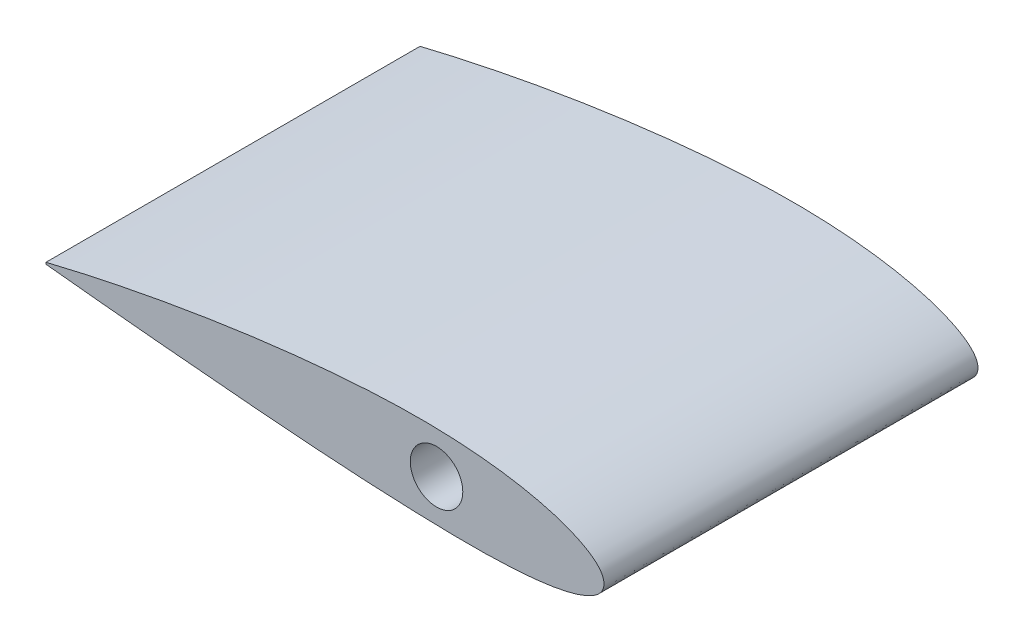
ISO-10303-21;
HEADER;
FILE_DESCRIPTION(('STEP AP214'),'2;1');
FILE_NAME('part.step','',(''),(''),'','','');
FILE_SCHEMA(('AUTOMOTIVE_DESIGN { 1 0 10303 214 1 1 1 1 }'));
ENDSEC;
DATA;
#1=APPLICATION_CONTEXT('core data for automotive mechanical design processes');
#2=APPLICATION_PROTOCOL_DEFINITION('international standard','automotive_design',2000,#1);
#3=PRODUCT_CONTEXT('',#1,'mechanical');
#4=PRODUCT('Part','Part','',(#3));
#5=PRODUCT_RELATED_PRODUCT_CATEGORY('part','',(#4));
#6=PRODUCT_DEFINITION_FORMATION('','',#4);
#7=PRODUCT_DEFINITION_CONTEXT('part definition',#1,'design');
#8=PRODUCT_DEFINITION('design','',#6,#7);
#9=PRODUCT_DEFINITION_SHAPE('','',#8);
#10=(LENGTH_UNIT() NAMED_UNIT(*) SI_UNIT(.MILLI.,.METRE.));
#11=(NAMED_UNIT(*) PLANE_ANGLE_UNIT() SI_UNIT($,.RADIAN.));
#12=(NAMED_UNIT(*) SI_UNIT($,.STERADIAN.) SOLID_ANGLE_UNIT());
#13=UNCERTAINTY_MEASURE_WITH_UNIT(LENGTH_MEASURE(1.E-05),#10,'distance_accuracy_value','');
#14=(GEOMETRIC_REPRESENTATION_CONTEXT(3) GLOBAL_UNCERTAINTY_ASSIGNED_CONTEXT((#13)) GLOBAL_UNIT_ASSIGNED_CONTEXT((#10,
#11,#12)) REPRESENTATION_CONTEXT('',''));
#15=CARTESIAN_POINT('',(0.,0.,0.));
#16=DIRECTION('',(0.,0.,1.));
#17=DIRECTION('',(1.,0.,0.));
#18=AXIS2_PLACEMENT_3D('',#15,#16,#17);
#19=CARTESIAN_POINT('',(-238.675,-0.37508053676849,80.));
#20=CARTESIAN_POINT('',(-238.666663292953,-0.375050863072438,80.));
#21=CARTESIAN_POINT('',(-238.533564190899,-0.374577109793486,80.));
#22=CARTESIAN_POINT('',(-238.031628616167,-0.459131062710434,80.));
#23=CARTESIAN_POINT('',(-236.918777596448,-0.548714441388542,80.));
#24=CARTESIAN_POINT('',(-235.075678545581,-0.76095517688639,80.));
#25=CARTESIAN_POINT('',(-232.510834876533,-1.02388030996001,80.));
#26=CARTESIAN_POINT('',(-229.242958682381,-1.36749411255202,80.));
#27=CARTESIAN_POINT('',(-225.292785952385,-1.77365188828537,80.));
#28=CARTESIAN_POINT('',(-220.686424684762,-2.24255804571054,80.));
#29=CARTESIAN_POINT('',(-215.453758655435,-2.76722726492522,80.));
#30=CARTESIAN_POINT('',(-209.628691852222,-3.34283108572418,80.));
#31=CARTESIAN_POINT('',(-203.248714269813,-3.9636488535598,80.));
#32=CARTESIAN_POINT('',(-196.354672515369,-4.62408380851139,80.));
#33=CARTESIAN_POINT('',(-188.990455066798,-5.31826037328899,80.));
#34=CARTESIAN_POINT('',(-181.202687582147,-6.03996797145023,80.));
#35=CARTESIAN_POINT('',(-173.040409610973,-6.78241781383401,80.));
#36=CARTESIAN_POINT('',(-164.554742093909,-7.53800473084004,80.));
#37=CARTESIAN_POINT('',(-155.798543728106,-8.29805615250262,80.));
#38=CARTESIAN_POINT('',(-146.826058415856,-9.05261330669248,80.));
#39=CARTESIAN_POINT('',(-137.692556740699,-9.79029230983351,80.));
#40=CARTESIAN_POINT('',(-128.453973844615,-10.4981908917635,80.));
#41=CARTESIAN_POINT('',(-119.166555441531,-11.1621161975684,80.));
#42=CARTESIAN_POINT('',(-109.886493141607,-11.7661972052143,80.));
#43=CARTESIAN_POINT('',(-100.683075110224,-12.2946555816032,80.));
#44=CARTESIAN_POINT('',(-91.6285836949606,-12.7253438271158,80.));
#45=CARTESIAN_POINT('',(-82.7786921870013,-13.0968894820275,80.));
#46=CARTESIAN_POINT('',(-74.1699867937032,-13.3842580535361,80.));
#47=CARTESIAN_POINT('',(-65.8334260636264,-13.5712530144893,80.));
#48=CARTESIAN_POINT('',(-57.815433259119,-13.6399608707199,80.));
#49=CARTESIAN_POINT('',(-50.1607218840938,-13.574922495162,80.));
#50=CARTESIAN_POINT('',(-42.9121901914152,-13.3629694310071,80.));
#51=CARTESIAN_POINT('',(-36.110844653875,-12.9938007179093,80.));
#52=CARTESIAN_POINT('',(-29.7956590255382,-12.4601537182943,80.));
#53=CARTESIAN_POINT('',(-24.0033555478795,-11.7578375462023,80.));
#54=CARTESIAN_POINT('',(-18.7680656078937,-10.8855390450986,80.));
#55=CARTESIAN_POINT('',(-14.1208062248208,-9.84441937275085,80.));
#56=CARTESIAN_POINT('',(-10.0886886233779,-8.63729436639386,80.));
#57=CARTESIAN_POINT('',(-6.69372832298311,-7.26730024454799,80.));
#58=CARTESIAN_POINT('',(-3.95171243941146,-5.7340590204949,80.));
#59=CARTESIAN_POINT('',(-1.87387651663262,-4.02782014238745,80.));
#60=CARTESIAN_POINT('',(-0.485118951259659,-2.11664836578965,80.));
#61=CARTESIAN_POINT('',(0.129841681260909,-0.0130409179101534,80.));
#62=CARTESIAN_POINT('',(-0.0566600176232826,2.17249369177217,80.));
#63=CARTESIAN_POINT('',(-1.05224478430024,4.32261053654655,80.));
#64=CARTESIAN_POINT('',(-2.78315758748845,6.40154054100683,80.));
#65=CARTESIAN_POINT('',(-5.22523940459053,8.42890404838557,80.));
#66=CARTESIAN_POINT('',(-8.37248839454447,10.4021399743308,80.));
#67=CARTESIAN_POINT('',(-12.215187057347,12.3056413318674,80.));
#68=CARTESIAN_POINT('',(-16.7366506098345,14.1166483874967,80.));
#69=CARTESIAN_POINT('',(-21.9132823887991,15.8098332439349,80.));
#70=CARTESIAN_POINT('',(-27.7153397349142,17.3594147791403,80.));
#71=CARTESIAN_POINT('',(-34.1074981398145,18.740733946573,80.));
#72=CARTESIAN_POINT('',(-41.0493501705215,19.9313959586167,80.));
#73=CARTESIAN_POINT('',(-48.4958757217827,20.9121858560249,80.));
#74=CARTESIAN_POINT('',(-56.3979404764548,21.6677691121206,80.));
#75=CARTESIAN_POINT('',(-64.7028285842188,22.1871146236005,80.));
#76=CARTESIAN_POINT('',(-73.3548325703582,22.4639289954798,80.));
#77=CARTESIAN_POINT('',(-82.2957902060898,22.4959699101602,80.));
#78=CARTESIAN_POINT('',(-91.4486342363503,22.2881548735993,80.));
#79=CARTESIAN_POINT('',(-100.738687987478,21.8426127842224,80.));
#80=CARTESIAN_POINT('',(-110.108636297937,21.2290118841814,80.));
#81=CARTESIAN_POINT('',(-119.516781792918,20.4575999429822,80.));
#82=CARTESIAN_POINT('',(-128.917254841736,19.5454537408219,80.));
#83=CARTESIAN_POINT('',(-138.251141532901,18.5100040892258,80.));
#84=CARTESIAN_POINT('',(-147.460254498907,17.3698911233598,80.));
#85=CARTESIAN_POINT('',(-156.487494333661,16.1441123675552,80.));
#86=CARTESIAN_POINT('',(-165.277188297722,14.8519757188793,80.));
#87=CARTESIAN_POINT('',(-173.775416798479,13.5129394115959,80.));
#88=CARTESIAN_POINT('',(-181.930325644504,12.1465602710984,80.));
#89=CARTESIAN_POINT('',(-189.692424093711,10.7724611956736,80.));
#90=CARTESIAN_POINT('',(-197.0148667629,9.41030561031926,80.));
#91=CARTESIAN_POINT('',(-203.853716701299,8.07974656862907,80.));
#92=CARTESIAN_POINT('',(-210.168186318524,6.80032770009332,80.));
#93=CARTESIAN_POINT('',(-215.920852716755,5.59131841569136,80.));
#94=CARTESIAN_POINT('',(-221.077844804439,4.47147637484479,80.));
#95=CARTESIAN_POINT('',(-225.608999635099,3.45873604657225,80.));
#96=CARTESIAN_POINT('',(-229.487989986291,2.569844813325,80.));
#97=CARTESIAN_POINT('',(-232.692417394295,1.81993811866353,80.));
#98=CARTESIAN_POINT('',(-235.203893788459,1.22216361784148,80.));
#99=CARTESIAN_POINT('',(-237.008061316928,0.787162185292062,80.));
#100=CARTESIAN_POINT('',(-238.086350230101,0.525005253352344,80.));
#101=CARTESIAN_POINT('',(-238.56211597697,0.408767052231386,80.));
#102=CARTESIAN_POINT('',(-238.675,0.381187437980616,80.));
#103=B_SPLINE_CURVE_WITH_KNOTS('',3,(#19,#20,#21,#22,#23,#24,#25,#26,#27,#28,#29,#30,#31,#32,
#33,#34,#35,#36,#37,#38,#39,#40,#41,#42,#43,#44,#45,#46,#47,#48,#49,#50,#51,#52,#53,#54,#55,#56,
#57,#58,#59,#60,#61,#62,#63,#64,#65,#66,#67,#68,#69,#70,#71,#72,#73,#74,#75,#76,#77,#78,#79,#80,
#81,#82,#83,#84,#85,#86,#87,#88,#89,#90,#91,#92,#93,#94,#95,#96,#97,#98,#99,#100,#101,#102),
.UNSPECIFIED.,.F.,.F.,(4,1,1,1,1,1,1,1,1,1,1,1,1,1,1,1,1,1,1,1,1,1,1,1,1,1,1,1,1,1,1,1,1,1,1,1,
1,1,1,1,1,1,1,1,1,1,1,1,1,1,1,1,1,1,1,1,1,1,1,1,1,1,1,1,1,1,1,1,1,1,1,1,1,1,1,1,1,1,1,1,1,4),
(0.,5.08983121567663E-05,0.000812613374336135,0.00309262456952319,0.00687558863149096,
0.0121361257746557,0.0188390968849241,0.0269399706687805,0.0363852634248657,0.0471130335089661,
0.0590534141067491,0.0721291711557229,0.08625627751661,0.101344499081693,0.117297992799809,
0.134015920127776,0.151393081890756,0.169320581787383,0.187686525719967,0.206376762704387,
0.225275670285792,0.244266983208367,0.263234658798422,0.282063766646717,0.300559253684108,
0.318587731157786,0.336152769408685,0.353156616755799,0.369506357571164,0.38511439984048,
0.399898948068483,0.413784529490576,0.426702684427147,0.438592994912702,0.449404730699981,
0.45909958624753,0.467656370654935,0.475079310861143,0.481413205896041,0.486771099267155,
0.491379521772645,0.495622717507068,0.499866195811906,0.504481525001335,0.509866163116046,
0.516260001394323,0.523787212648484,0.532501323458089,0.542412959890516,0.55350499062957,
0.565740788674186,0.57906891661698,0.593425934333544,0.608738206606506,0.624923183620191,
0.64189042119243,0.659542494881772,0.677775894553578,0.696481942056537,0.715442097984496,
0.734566308966686,0.753819552346971,0.773083142580075,0.792237833709954,0.811164768626894,
0.829746378193079,0.847867220318462,0.865414755261854,0.882280058623152,0.898358477291575,
0.913550235948961,0.927761002710635,0.940902422294529,0.952892623895837,0.96365670882514,
0.973127220059843,0.981244592350929,0.987957577739128,0.993223637730983,0.997009290525797,
0.999290400119417,1.),.UNSPECIFIED.);
#104=DIRECTION('',(0.,0.,-1.));
#105=VECTOR('',#104,1.);
#106=SURFACE_OF_LINEAR_EXTRUSION('',#103,#105);
#107=CARTESIAN_POINT('',(-238.675,-0.37508053676849,-80.));
#108=CARTESIAN_POINT('',(-238.666663292953,-0.375050863072438,-80.));
#109=CARTESIAN_POINT('',(-238.533564190899,-0.374577109793486,-80.));
#110=CARTESIAN_POINT('',(-238.031628616167,-0.459131062710434,-80.));
#111=CARTESIAN_POINT('',(-236.918777596448,-0.548714441388542,-80.));
#112=CARTESIAN_POINT('',(-235.075678545581,-0.76095517688639,-80.));
#113=CARTESIAN_POINT('',(-232.510834876533,-1.02388030996001,-80.));
#114=CARTESIAN_POINT('',(-229.242958682381,-1.36749411255202,-80.));
#115=CARTESIAN_POINT('',(-225.292785952385,-1.77365188828537,-80.));
#116=CARTESIAN_POINT('',(-220.686424684762,-2.24255804571054,-80.));
#117=CARTESIAN_POINT('',(-215.453758655435,-2.76722726492522,-80.));
#118=CARTESIAN_POINT('',(-209.628691852222,-3.34283108572418,-80.));
#119=CARTESIAN_POINT('',(-203.248714269813,-3.9636488535598,-80.));
#120=CARTESIAN_POINT('',(-196.354672515369,-4.62408380851139,-80.));
#121=CARTESIAN_POINT('',(-188.990455066798,-5.31826037328899,-80.));
#122=CARTESIAN_POINT('',(-181.202687582147,-6.03996797145023,-80.));
#123=CARTESIAN_POINT('',(-173.040409610973,-6.78241781383401,-80.));
#124=CARTESIAN_POINT('',(-164.554742093909,-7.53800473084004,-80.));
#125=CARTESIAN_POINT('',(-155.798543728106,-8.29805615250262,-80.));
#126=CARTESIAN_POINT('',(-146.826058415856,-9.05261330669248,-80.));
#127=CARTESIAN_POINT('',(-137.692556740699,-9.79029230983351,-80.));
#128=CARTESIAN_POINT('',(-128.453973844615,-10.4981908917635,-80.));
#129=CARTESIAN_POINT('',(-119.166555441531,-11.1621161975684,-80.));
#130=CARTESIAN_POINT('',(-109.886493141607,-11.7661972052143,-80.));
#131=CARTESIAN_POINT('',(-100.683075110224,-12.2946555816032,-80.));
#132=CARTESIAN_POINT('',(-91.6285836949606,-12.7253438271158,-80.));
#133=CARTESIAN_POINT('',(-82.7786921870013,-13.0968894820275,-80.));
#134=CARTESIAN_POINT('',(-74.1699867937032,-13.3842580535361,-80.));
#135=CARTESIAN_POINT('',(-65.8334260636264,-13.5712530144893,-80.));
#136=CARTESIAN_POINT('',(-57.815433259119,-13.6399608707199,-80.));
#137=CARTESIAN_POINT('',(-50.1607218840938,-13.574922495162,-80.));
#138=CARTESIAN_POINT('',(-42.9121901914152,-13.3629694310071,-80.));
#139=CARTESIAN_POINT('',(-36.110844653875,-12.9938007179093,-80.));
#140=CARTESIAN_POINT('',(-29.7956590255382,-12.4601537182943,-80.));
#141=CARTESIAN_POINT('',(-24.0033555478795,-11.7578375462023,-80.));
#142=CARTESIAN_POINT('',(-18.7680656078937,-10.8855390450986,-80.));
#143=CARTESIAN_POINT('',(-14.1208062248208,-9.84441937275085,-80.));
#144=CARTESIAN_POINT('',(-10.0886886233779,-8.63729436639386,-80.));
#145=CARTESIAN_POINT('',(-6.69372832298311,-7.26730024454799,-80.));
#146=CARTESIAN_POINT('',(-3.95171243941146,-5.7340590204949,-80.));
#147=CARTESIAN_POINT('',(-1.87387651663262,-4.02782014238745,-80.));
#148=CARTESIAN_POINT('',(-0.485118951259659,-2.11664836578965,-80.));
#149=CARTESIAN_POINT('',(0.129841681260909,-0.0130409179101534,-80.));
#150=CARTESIAN_POINT('',(-0.0566600176232826,2.17249369177217,-80.));
#151=CARTESIAN_POINT('',(-1.05224478430024,4.32261053654655,-80.));
#152=CARTESIAN_POINT('',(-2.78315758748845,6.40154054100683,-80.));
#153=CARTESIAN_POINT('',(-5.22523940459053,8.42890404838557,-80.));
#154=CARTESIAN_POINT('',(-8.37248839454447,10.4021399743308,-80.));
#155=CARTESIAN_POINT('',(-12.215187057347,12.3056413318674,-80.));
#156=CARTESIAN_POINT('',(-16.7366506098345,14.1166483874967,-80.));
#157=CARTESIAN_POINT('',(-21.9132823887991,15.8098332439349,-80.));
#158=CARTESIAN_POINT('',(-27.7153397349142,17.3594147791403,-80.));
#159=CARTESIAN_POINT('',(-34.1074981398145,18.740733946573,-80.));
#160=CARTESIAN_POINT('',(-41.0493501705215,19.9313959586167,-80.));
#161=CARTESIAN_POINT('',(-48.4958757217827,20.9121858560249,-80.));
#162=CARTESIAN_POINT('',(-56.3979404764548,21.6677691121206,-80.));
#163=CARTESIAN_POINT('',(-64.7028285842188,22.1871146236005,-80.));
#164=CARTESIAN_POINT('',(-73.3548325703582,22.4639289954798,-80.));
#165=CARTESIAN_POINT('',(-82.2957902060898,22.4959699101602,-80.));
#166=CARTESIAN_POINT('',(-91.4486342363503,22.2881548735993,-80.));
#167=CARTESIAN_POINT('',(-100.738687987478,21.8426127842224,-80.));
#168=CARTESIAN_POINT('',(-110.108636297937,21.2290118841814,-80.));
#169=CARTESIAN_POINT('',(-119.516781792918,20.4575999429822,-80.));
#170=CARTESIAN_POINT('',(-128.917254841736,19.5454537408219,-80.));
#171=CARTESIAN_POINT('',(-138.251141532901,18.5100040892258,-80.));
#172=CARTESIAN_POINT('',(-147.460254498907,17.3698911233598,-80.));
#173=CARTESIAN_POINT('',(-156.487494333661,16.1441123675552,-80.));
#174=CARTESIAN_POINT('',(-165.277188297722,14.8519757188793,-80.));
#175=CARTESIAN_POINT('',(-173.775416798479,13.5129394115959,-80.));
#176=CARTESIAN_POINT('',(-181.930325644504,12.1465602710984,-80.));
#177=CARTESIAN_POINT('',(-189.692424093711,10.7724611956736,-80.));
#178=CARTESIAN_POINT('',(-197.0148667629,9.41030561031926,-80.));
#179=CARTESIAN_POINT('',(-203.853716701299,8.07974656862907,-80.));
#180=CARTESIAN_POINT('',(-210.168186318524,6.80032770009332,-80.));
#181=CARTESIAN_POINT('',(-215.920852716755,5.59131841569136,-80.));
#182=CARTESIAN_POINT('',(-221.077844804439,4.47147637484479,-80.));
#183=CARTESIAN_POINT('',(-225.608999635099,3.45873604657225,-80.));
#184=CARTESIAN_POINT('',(-229.487989986291,2.569844813325,-80.));
#185=CARTESIAN_POINT('',(-232.692417394295,1.81993811866353,-80.));
#186=CARTESIAN_POINT('',(-235.203893788459,1.22216361784148,-80.));
#187=CARTESIAN_POINT('',(-237.008061316928,0.787162185292062,-80.));
#188=CARTESIAN_POINT('',(-238.086350230101,0.525005253352344,-80.));
#189=CARTESIAN_POINT('',(-238.56211597697,0.408767052231386,-80.));
#190=CARTESIAN_POINT('',(-238.675,0.381187437980616,-80.));
#191=B_SPLINE_CURVE_WITH_KNOTS('',3,(#107,#108,#109,#110,#111,#112,#113,#114,#115,#116,#117,
#118,#119,#120,#121,#122,#123,#124,#125,#126,#127,#128,#129,#130,#131,#132,#133,#134,#135,#136,
#137,#138,#139,#140,#141,#142,#143,#144,#145,#146,#147,#148,#149,#150,#151,#152,#153,#154,#155,
#156,#157,#158,#159,#160,#161,#162,#163,#164,#165,#166,#167,#168,#169,#170,#171,#172,#173,#174,
#175,#176,#177,#178,#179,#180,#181,#182,#183,#184,#185,#186,#187,#188,#189,#190),.UNSPECIFIED.,
.F.,.F.,(4,1,1,1,1,1,1,1,1,1,1,1,1,1,1,1,1,1,1,1,1,1,1,1,1,1,1,1,1,1,1,1,1,1,1,1,1,1,1,1,1,1,1,
1,1,1,1,1,1,1,1,1,1,1,1,1,1,1,1,1,1,1,1,1,1,1,1,1,1,1,1,1,1,1,1,1,1,1,1,1,1,4),(0.,
5.08983121567663E-05,0.000812613374336135,0.00309262456952319,0.00687558863149096,
0.0121361257746557,0.0188390968849241,0.0269399706687805,0.0363852634248657,0.0471130335089661,
0.0590534141067491,0.0721291711557229,0.08625627751661,0.101344499081693,0.117297992799809,
0.134015920127776,0.151393081890756,0.169320581787383,0.187686525719967,0.206376762704387,
0.225275670285792,0.244266983208367,0.263234658798422,0.282063766646717,0.300559253684108,
0.318587731157786,0.336152769408685,0.353156616755799,0.369506357571164,0.38511439984048,
0.399898948068483,0.413784529490576,0.426702684427147,0.438592994912702,0.449404730699981,
0.45909958624753,0.467656370654935,0.475079310861143,0.481413205896041,0.486771099267155,
0.491379521772645,0.495622717507068,0.499866195811906,0.504481525001335,0.509866163116046,
0.516260001394323,0.523787212648484,0.532501323458089,0.542412959890516,0.55350499062957,
0.565740788674186,0.57906891661698,0.593425934333544,0.608738206606506,0.624923183620191,
0.64189042119243,0.659542494881772,0.677775894553578,0.696481942056537,0.715442097984496,
0.734566308966686,0.753819552346971,0.773083142580075,0.792237833709954,0.811164768626894,
0.829746378193079,0.847867220318462,0.865414755261854,0.882280058623152,0.898358477291575,
0.913550235948961,0.927761002710635,0.940902422294529,0.952892623895837,0.96365670882514,
0.973127220059843,0.981244592350929,0.987957577739128,0.993223637730983,0.997009290525797,
0.999290400119417,1.),.UNSPECIFIED.);
#192=CARTESIAN_POINT('',(-238.675,-0.37508053676849,-80.));
#193=VERTEX_POINT('',#192);
#194=CARTESIAN_POINT('',(-238.675,0.381187437980616,-80.));
#195=VERTEX_POINT('',#194);
#196=EDGE_CURVE('E72',#193,#195,#191,.T.);
#197=ORIENTED_EDGE('',*,*,#196,.T.);
#198=DIRECTION('',(0.,0.,-1.));
#199=VECTOR('',#198,1.);
#200=CARTESIAN_POINT('',(-238.675,0.381187437980616,80.));
#201=LINE('',#200,#199);
#202=CARTESIAN_POINT('',(-238.675,0.381187437980616,80.));
#203=VERTEX_POINT('',#202);
#204=EDGE_CURVE('E11',#203,#195,#201,.T.);
#205=ORIENTED_EDGE('',*,*,#204,.F.);
#206=CARTESIAN_POINT('',(-238.675,-0.37508053676849,80.));
#207=VERTEX_POINT('',#206);
#208=EDGE_CURVE('E71',#207,#203,#103,.T.);
#209=ORIENTED_EDGE('',*,*,#208,.F.);
#210=DIRECTION('',(0.,0.,-1.));
#211=VECTOR('',#210,1.);
#212=CARTESIAN_POINT('',(-238.675,-0.37508053676849,80.));
#213=LINE('',#212,#211);
#214=EDGE_CURVE('E49',#207,#193,#213,.T.);
#215=ORIENTED_EDGE('',*,*,#214,.T.);
#216=EDGE_LOOP('',(#197,#205,#209,#215));
#217=FACE_BOUND('',#216,.T.);
#218=ADVANCED_FACE('F39',(#217),#106,.F.);
#219=CARTESIAN_POINT('',(-238.675,0.381187437980616,80.));
#220=DIRECTION('',(1.,0.,0.));
#221=DIRECTION('',(0.,0.,-1.));
#222=AXIS2_PLACEMENT_3D('',#219,#220,#221);
#223=PLANE('',#222);
#224=DIRECTION('',(0.,-1.,0.));
#225=VECTOR('',#224,1.);
#226=CARTESIAN_POINT('',(-238.675,0.381187437980616,-80.));
#227=LINE('',#226,#225);
#228=EDGE_CURVE('E64',#195,#193,#227,.T.);
#229=ORIENTED_EDGE('',*,*,#228,.T.);
#230=ORIENTED_EDGE('',*,*,#214,.F.);
#231=DIRECTION('',(0.,-1.,0.));
#232=VECTOR('',#231,1.);
#233=CARTESIAN_POINT('',(-238.675,0.381187437980616,80.));
#234=LINE('',#233,#232);
#235=EDGE_CURVE('E56',#203,#207,#234,.T.);
#236=ORIENTED_EDGE('',*,*,#235,.F.);
#237=ORIENTED_EDGE('',*,*,#204,.T.);
#238=EDGE_LOOP('',(#229,#230,#236,#237));
#239=FACE_BOUND('',#238,.T.);
#240=ADVANCED_FACE('F67',(#239),#223,.F.);
#241=CARTESIAN_POINT('',(-0.181265189195666,2.14205306272746,80.));
#242=DIRECTION('',(0.,0.,1.));
#243=DIRECTION('',(1.,0.,0.));
#244=AXIS2_PLACEMENT_3D('',#241,#242,#243);
#245=PLANE('',#244);
#246=CARTESIAN_POINT('',(-71.603,4.475,80.));
#247=DIRECTION('',(0.,0.,1.));
#248=DIRECTION('',(1.,0.,0.));
#249=AXIS2_PLACEMENT_3D('',#246,#247,#248);
#250=CIRCLE('',#249,11.2275);
#251=CARTESIAN_POINT('',(-60.3755,4.475,80.));
#252=VERTEX_POINT('',#251);
#253=EDGE_CURVE('E77',#252,#252,#250,.T.);
#254=ORIENTED_EDGE('',*,*,#253,.F.);
#255=EDGE_LOOP('',(#254));
#256=FACE_BOUND('',#255,.T.);
#257=ORIENTED_EDGE('',*,*,#208,.T.);
#258=ORIENTED_EDGE('',*,*,#235,.T.);
#259=EDGE_LOOP('',(#257,#258));
#260=FACE_BOUND('',#259,.T.);
#261=ADVANCED_FACE('F93',(#256,#260),#245,.T.);
#262=CARTESIAN_POINT('',(-0.181265189195666,2.14205306272746,-80.));
#263=DIRECTION('',(0.,0.,1.));
#264=DIRECTION('',(1.,0.,0.));
#265=AXIS2_PLACEMENT_3D('',#262,#263,#264);
#266=PLANE('',#265);
#267=CARTESIAN_POINT('',(-71.603,4.475,-80.));
#268=DIRECTION('',(0.,0.,1.));
#269=DIRECTION('',(1.,0.,0.));
#270=AXIS2_PLACEMENT_3D('',#267,#268,#269);
#271=CIRCLE('',#270,11.2275);
#272=CARTESIAN_POINT('',(-60.3755,4.475,-80.));
#273=VERTEX_POINT('',#272);
#274=EDGE_CURVE('E43',#273,#273,#271,.T.);
#275=ORIENTED_EDGE('',*,*,#274,.T.);
#276=EDGE_LOOP('',(#275));
#277=FACE_BOUND('',#276,.T.);
#278=ORIENTED_EDGE('',*,*,#196,.F.);
#279=ORIENTED_EDGE('',*,*,#228,.F.);
#280=EDGE_LOOP('',(#278,#279));
#281=FACE_BOUND('',#280,.T.);
#282=ADVANCED_FACE('F76',(#277,#281),#266,.F.);
#283=CARTESIAN_POINT('',(-71.603,4.475,-81.));
#284=DIRECTION('',(0.,0.,1.));
#285=DIRECTION('',(1.,0.,0.));
#286=AXIS2_PLACEMENT_3D('',#283,#284,#285);
#287=CYLINDRICAL_SURFACE('',#286,11.2275);
#288=CARTESIAN_POINT('',(-60.3755,4.475,80.));
#289=CARTESIAN_POINT('',(-60.3755,4.475,78.3333333333333));
#290=CARTESIAN_POINT('',(-60.3755,4.475,76.6666666666666));
#291=CARTESIAN_POINT('',(-60.3755,4.475,73.3333333333333));
#292=CARTESIAN_POINT('',(-60.3755,4.475,71.6666666666666));
#293=CARTESIAN_POINT('',(-60.3755,4.475,68.3333333333333));
#294=CARTESIAN_POINT('',(-60.3755,4.475,66.6666666666667));
#295=CARTESIAN_POINT('',(-60.3755,4.475,63.3333333333333));
#296=CARTESIAN_POINT('',(-60.3755,4.475,61.6666666666667));
#297=CARTESIAN_POINT('',(-60.3755,4.475,58.3333333333333));
#298=CARTESIAN_POINT('',(-60.3755,4.475,56.6666666666667));
#299=CARTESIAN_POINT('',(-60.3755,4.475,53.3333333333333));
#300=CARTESIAN_POINT('',(-60.3755,4.475,51.6666666666666));
#301=CARTESIAN_POINT('',(-60.3755,4.475,48.3333333333333));
#302=CARTESIAN_POINT('',(-60.3755,4.475,46.6666666666666));
#303=CARTESIAN_POINT('',(-60.3755,4.475,43.3333333333333));
#304=CARTESIAN_POINT('',(-60.3755,4.475,41.6666666666666));
#305=CARTESIAN_POINT('',(-60.3755,4.475,38.3333333333333));
#306=CARTESIAN_POINT('',(-60.3755,4.475,36.6666666666667));
#307=CARTESIAN_POINT('',(-60.3755,4.475,33.3333333333333));
#308=CARTESIAN_POINT('',(-60.3755,4.475,31.6666666666667));
#309=CARTESIAN_POINT('',(-60.3755,4.475,28.3333333333333));
#310=CARTESIAN_POINT('',(-60.3755,4.475,26.6666666666666));
#311=CARTESIAN_POINT('',(-60.3755,4.475,23.3333333333333));
#312=CARTESIAN_POINT('',(-60.3755,4.475,21.6666666666666));
#313=CARTESIAN_POINT('',(-60.3755,4.475,18.3333333333333));
#314=CARTESIAN_POINT('',(-60.3755,4.475,16.6666666666667));
#315=CARTESIAN_POINT('',(-60.3755,4.475,13.3333333333333));
#316=CARTESIAN_POINT('',(-60.3755,4.475,11.6666666666666));
#317=CARTESIAN_POINT('',(-60.3755,4.475,8.33333333333332));
#318=CARTESIAN_POINT('',(-60.3755,4.475,6.66666666666665));
#319=CARTESIAN_POINT('',(-60.3755,4.475,3.33333333333332));
#320=CARTESIAN_POINT('',(-60.3755,4.475,1.66666666666665));
#321=CARTESIAN_POINT('',(-60.3755,4.475,-1.66666666666668));
#322=CARTESIAN_POINT('',(-60.3755,4.475,-3.33333333333335));
#323=CARTESIAN_POINT('',(-60.3755,4.475,-6.66666666666668));
#324=CARTESIAN_POINT('',(-60.3755,4.475,-8.33333333333334));
#325=CARTESIAN_POINT('',(-60.3755,4.475,-11.6666666666667));
#326=CARTESIAN_POINT('',(-60.3755,4.475,-13.3333333333333));
#327=CARTESIAN_POINT('',(-60.3755,4.475,-16.6666666666667));
#328=CARTESIAN_POINT('',(-60.3755,4.475,-18.3333333333333));
#329=CARTESIAN_POINT('',(-60.3755,4.475,-21.6666666666667));
#330=CARTESIAN_POINT('',(-60.3755,4.475,-23.3333333333333));
#331=CARTESIAN_POINT('',(-60.3755,4.475,-26.6666666666667));
#332=CARTESIAN_POINT('',(-60.3755,4.475,-28.3333333333333));
#333=CARTESIAN_POINT('',(-60.3755,4.475,-31.6666666666667));
#334=CARTESIAN_POINT('',(-60.3755,4.475,-33.3333333333333));
#335=CARTESIAN_POINT('',(-60.3755,4.475,-36.6666666666667));
#336=CARTESIAN_POINT('',(-60.3755,4.475,-38.3333333333333));
#337=CARTESIAN_POINT('',(-60.3755,4.475,-41.6666666666667));
#338=CARTESIAN_POINT('',(-60.3755,4.475,-43.3333333333333));
#339=CARTESIAN_POINT('',(-60.3755,4.475,-46.6666666666667));
#340=CARTESIAN_POINT('',(-60.3755,4.475,-48.3333333333333));
#341=CARTESIAN_POINT('',(-60.3755,4.475,-51.6666666666667));
#342=CARTESIAN_POINT('',(-60.3755,4.475,-53.3333333333333));
#343=CARTESIAN_POINT('',(-60.3755,4.475,-56.6666666666667));
#344=CARTESIAN_POINT('',(-60.3755,4.475,-58.3333333333333));
#345=CARTESIAN_POINT('',(-60.3755,4.475,-61.6666666666667));
#346=CARTESIAN_POINT('',(-60.3755,4.475,-63.3333333333333));
#347=CARTESIAN_POINT('',(-60.3755,4.475,-66.6666666666667));
#348=CARTESIAN_POINT('',(-60.3755,4.475,-68.3333333333333));
#349=CARTESIAN_POINT('',(-60.3755,4.475,-71.6666666666667));
#350=CARTESIAN_POINT('',(-60.3755,4.475,-73.3333333333333));
#351=CARTESIAN_POINT('',(-60.3755,4.475,-76.6666666666667));
#352=CARTESIAN_POINT('',(-60.3755,4.475,-78.3333333333333));
#353=CARTESIAN_POINT('',(-60.3755,4.475,-80.));
#354=B_SPLINE_CURVE_WITH_KNOTS('',3,(#288,#289,#290,#291,#292,#293,#294,#295,#296,#297,#298,
#299,#300,#301,#302,#303,#304,#305,#306,#307,#308,#309,#310,#311,#312,#313,#314,#315,#316,#317,
#318,#319,#320,#321,#322,#323,#324,#325,#326,#327,#328,#329,#330,#331,#332,#333,#334,#335,#336,
#337,#338,#339,#340,#341,#342,#343,#344,#345,#346,#347,#348,#349,#350,#351,#352,#353),
.UNSPECIFIED.,.F.,.F.,(4,2,2,2,2,2,2,2,2,2,2,2,2,2,2,2,2,2,2,2,2,2,2,2,2,2,2,2,2,2,2,2,4),(0.,
5.,10.,15.,20.,25.,30.,35.,40.,45.,50.,55.,60.,65.,70.,75.,80.,85.,90.,95.,100.,105.,110.,115.,
120.,125.,130.,135.,140.,145.,150.,155.,160.),.UNSPECIFIED.);
#355=EDGE_CURVE('BSEAM101',#252,#273,#354,.T.);
#356=ORIENTED_EDGE('',*,*,#253,.T.);
#357=ORIENTED_EDGE('',*,*,#274,.F.);
#358=ORIENTED_EDGE('',*,*,#355,.T.);
#359=ORIENTED_EDGE('',*,*,#355,.F.);
#360=EDGE_LOOP('',(#356,#358,#357,#359));
#361=FACE_BOUND('',#360,.T.);
#362=ADVANCED_FACE('F101',(#361),#287,.F.);
#363=CLOSED_SHELL('',(#218,#240,#261,#282,#362));
#364=MANIFOLD_SOLID_BREP('B2',#363);
#365=ADVANCED_BREP_SHAPE_REPRESENTATION('',(#18,#364),#14);
#366=SHAPE_DEFINITION_REPRESENTATION(#9,#365);
ENDSEC;
END-ISO-10303-21;
